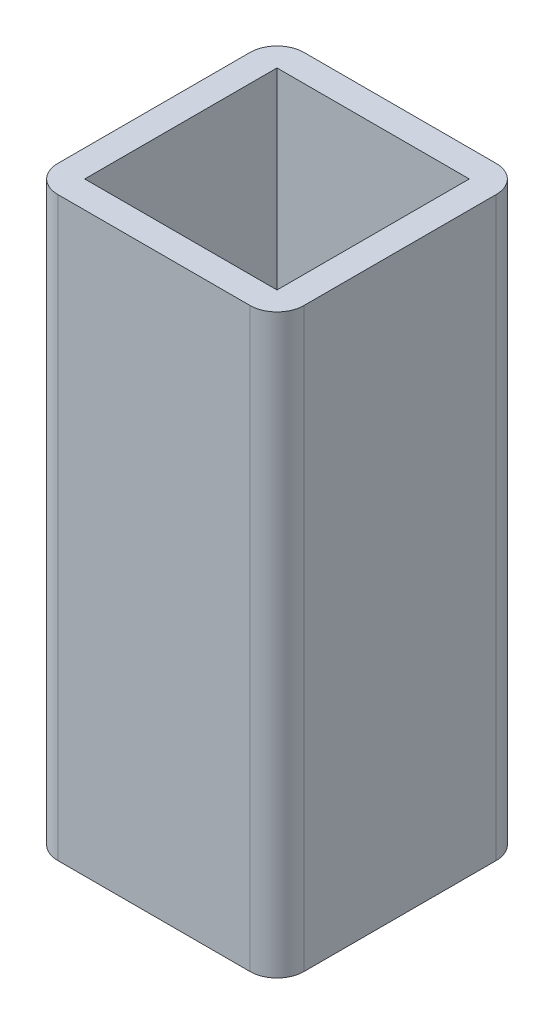
ISO-10303-21;
HEADER;
FILE_DESCRIPTION(('STEP AP214'),'2;1');
FILE_NAME('part.step','',(''),(''),'','','');
FILE_SCHEMA(('AUTOMOTIVE_DESIGN { 1 0 10303 214 1 1 1 1 }'));
ENDSEC;
DATA;
#1=APPLICATION_CONTEXT('core data for automotive mechanical design processes');
#2=APPLICATION_PROTOCOL_DEFINITION('international standard','automotive_design',2000,#1);
#3=PRODUCT_CONTEXT('',#1,'mechanical');
#4=PRODUCT('Part','Part','',(#3));
#5=PRODUCT_RELATED_PRODUCT_CATEGORY('part','',(#4));
#6=PRODUCT_DEFINITION_FORMATION('','',#4);
#7=PRODUCT_DEFINITION_CONTEXT('part definition',#1,'design');
#8=PRODUCT_DEFINITION('design','',#6,#7);
#9=PRODUCT_DEFINITION_SHAPE('','',#8);
#10=(LENGTH_UNIT() NAMED_UNIT(*) SI_UNIT(.MILLI.,.METRE.));
#11=(NAMED_UNIT(*) PLANE_ANGLE_UNIT() SI_UNIT($,.RADIAN.));
#12=(NAMED_UNIT(*) SI_UNIT($,.STERADIAN.) SOLID_ANGLE_UNIT());
#13=UNCERTAINTY_MEASURE_WITH_UNIT(LENGTH_MEASURE(1.E-05),#10,'distance_accuracy_value','');
#14=(GEOMETRIC_REPRESENTATION_CONTEXT(3) GLOBAL_UNCERTAINTY_ASSIGNED_CONTEXT((#13)) GLOBAL_UNIT_ASSIGNED_CONTEXT((#10,
#11,#12)) REPRESENTATION_CONTEXT('',''));
#15=CARTESIAN_POINT('',(0.,0.,0.));
#16=DIRECTION('',(0.,0.,1.));
#17=DIRECTION('',(1.,0.,0.));
#18=AXIS2_PLACEMENT_3D('',#15,#16,#17);
#19=CARTESIAN_POINT('',(22.8,60.,2.8));
#20=DIRECTION('',(0.,-1.,0.));
#21=DIRECTION('',(0.,0.,-1.));
#22=AXIS2_PLACEMENT_3D('',#19,#20,#21);
#23=CYLINDRICAL_SURFACE('',#22,2.8);
#24=CARTESIAN_POINT('',(22.8,0.,2.8));
#25=DIRECTION('',(0.,1.,0.));
#26=DIRECTION('',(0.,0.,-1.));
#27=AXIS2_PLACEMENT_3D('',#24,#25,#26);
#28=CIRCLE('',#27,2.8);
#29=CARTESIAN_POINT('',(25.6,0.,2.80000000000002));
#30=VERTEX_POINT('',#29);
#31=CARTESIAN_POINT('',(22.8,0.,0.));
#32=VERTEX_POINT('',#31);
#33=EDGE_CURVE('E158',#30,#32,#28,.T.);
#34=ORIENTED_EDGE('',*,*,#33,.T.);
#35=DIRECTION('',(0.,-1.,0.));
#36=VECTOR('',#35,1.);
#37=CARTESIAN_POINT('',(22.8,60.,0.));
#38=LINE('',#37,#36);
#39=CARTESIAN_POINT('',(22.8,60.,0.));
#40=VERTEX_POINT('',#39);
#41=EDGE_CURVE('E11',#40,#32,#38,.T.);
#42=ORIENTED_EDGE('',*,*,#41,.F.);
#43=CARTESIAN_POINT('',(22.8,60.,2.8));
#44=DIRECTION('',(0.,1.,0.));
#45=DIRECTION('',(0.,0.,-1.));
#46=AXIS2_PLACEMENT_3D('',#43,#44,#45);
#47=CIRCLE('',#46,2.8);
#48=CARTESIAN_POINT('',(25.6,60.,2.80000000000002));
#49=VERTEX_POINT('',#48);
#50=EDGE_CURVE('E159',#49,#40,#47,.T.);
#51=ORIENTED_EDGE('',*,*,#50,.F.);
#52=DIRECTION('',(0.,-1.,0.));
#53=VECTOR('',#52,1.);
#54=CARTESIAN_POINT('',(25.6,60.,2.80000000000002));
#55=LINE('',#54,#53);
#56=EDGE_CURVE('E177',#49,#30,#55,.T.);
#57=ORIENTED_EDGE('',*,*,#56,.T.);
#58=EDGE_LOOP('',(#34,#42,#51,#57));
#59=FACE_BOUND('',#58,.T.);
#60=ADVANCED_FACE('F33',(#59),#23,.T.);
#61=CARTESIAN_POINT('',(2.80000000000002,60.,0.));
#62=DIRECTION('',(0.,0.,1.));
#63=DIRECTION('',(1.,0.,0.));
#64=AXIS2_PLACEMENT_3D('',#61,#62,#63);
#65=PLANE('',#64);
#66=DIRECTION('',(-1.,0.,0.));
#67=VECTOR('',#66,1.);
#68=CARTESIAN_POINT('',(2.80000000000002,0.,0.));
#69=LINE('',#68,#67);
#70=CARTESIAN_POINT('',(2.80000000000002,0.,0.));
#71=VERTEX_POINT('',#70);
#72=EDGE_CURVE('E180',#32,#71,#69,.T.);
#73=ORIENTED_EDGE('',*,*,#72,.T.);
#74=DIRECTION('',(0.,-1.,0.));
#75=VECTOR('',#74,1.);
#76=CARTESIAN_POINT('',(2.80000000000002,60.,0.));
#77=LINE('',#76,#75);
#78=CARTESIAN_POINT('',(2.80000000000002,60.,0.));
#79=VERTEX_POINT('',#78);
#80=EDGE_CURVE('E40',#79,#71,#77,.T.);
#81=ORIENTED_EDGE('',*,*,#80,.F.);
#82=DIRECTION('',(-1.,0.,0.));
#83=VECTOR('',#82,1.);
#84=CARTESIAN_POINT('',(2.80000000000002,60.,0.));
#85=LINE('',#84,#83);
#86=EDGE_CURVE('E162',#40,#79,#85,.T.);
#87=ORIENTED_EDGE('',*,*,#86,.F.);
#88=ORIENTED_EDGE('',*,*,#41,.T.);
#89=EDGE_LOOP('',(#73,#81,#87,#88));
#90=FACE_BOUND('',#89,.T.);
#91=ADVANCED_FACE('F235',(#90),#65,.F.);
#92=CARTESIAN_POINT('',(2.8,60.,2.8));
#93=DIRECTION('',(0.,-1.,0.));
#94=DIRECTION('',(0.,0.,-1.));
#95=AXIS2_PLACEMENT_3D('',#92,#93,#94);
#96=CYLINDRICAL_SURFACE('',#95,2.8);
#97=CARTESIAN_POINT('',(2.8,0.,2.8));
#98=DIRECTION('',(0.,1.,0.));
#99=DIRECTION('',(0.,0.,1.));
#100=AXIS2_PLACEMENT_3D('',#97,#98,#99);
#101=CIRCLE('',#100,2.8);
#102=CARTESIAN_POINT('',(0.,0.,2.80000000000002));
#103=VERTEX_POINT('',#102);
#104=EDGE_CURVE('E182',#71,#103,#101,.T.);
#105=ORIENTED_EDGE('',*,*,#104,.T.);
#106=DIRECTION('',(0.,-1.,0.));
#107=VECTOR('',#106,1.);
#108=CARTESIAN_POINT('',(0.,60.,2.80000000000002));
#109=LINE('',#108,#107);
#110=CARTESIAN_POINT('',(0.,60.,2.80000000000002));
#111=VERTEX_POINT('',#110);
#112=EDGE_CURVE('E207',#111,#103,#109,.T.);
#113=ORIENTED_EDGE('',*,*,#112,.F.);
#114=CARTESIAN_POINT('',(2.8,60.,2.8));
#115=DIRECTION('',(0.,1.,0.));
#116=DIRECTION('',(0.,0.,1.));
#117=AXIS2_PLACEMENT_3D('',#114,#115,#116);
#118=CIRCLE('',#117,2.8);
#119=EDGE_CURVE('E165',#79,#111,#118,.T.);
#120=ORIENTED_EDGE('',*,*,#119,.F.);
#121=ORIENTED_EDGE('',*,*,#80,.T.);
#122=EDGE_LOOP('',(#105,#113,#120,#121));
#123=FACE_BOUND('',#122,.T.);
#124=ADVANCED_FACE('F214',(#123),#96,.T.);
#125=CARTESIAN_POINT('',(0.,60.,2.80000000000002));
#126=DIRECTION('',(1.,0.,0.));
#127=DIRECTION('',(0.,0.,-1.));
#128=AXIS2_PLACEMENT_3D('',#125,#126,#127);
#129=PLANE('',#128);
#130=DIRECTION('',(0.,0.,1.));
#131=VECTOR('',#130,1.);
#132=CARTESIAN_POINT('',(0.,0.,2.80000000000002));
#133=LINE('',#132,#131);
#134=CARTESIAN_POINT('',(0.,0.,22.8));
#135=VERTEX_POINT('',#134);
#136=EDGE_CURVE('E184',#103,#135,#133,.T.);
#137=ORIENTED_EDGE('',*,*,#136,.T.);
#138=DIRECTION('',(0.,-1.,0.));
#139=VECTOR('',#138,1.);
#140=CARTESIAN_POINT('',(0.,60.,22.8));
#141=LINE('',#140,#139);
#142=CARTESIAN_POINT('',(0.,60.,22.8));
#143=VERTEX_POINT('',#142);
#144=EDGE_CURVE('E204',#143,#135,#141,.T.);
#145=ORIENTED_EDGE('',*,*,#144,.F.);
#146=DIRECTION('',(0.,0.,1.));
#147=VECTOR('',#146,1.);
#148=CARTESIAN_POINT('',(0.,60.,2.80000000000002));
#149=LINE('',#148,#147);
#150=EDGE_CURVE('E167',#111,#143,#149,.T.);
#151=ORIENTED_EDGE('',*,*,#150,.F.);
#152=ORIENTED_EDGE('',*,*,#112,.T.);
#153=EDGE_LOOP('',(#137,#145,#151,#152));
#154=FACE_BOUND('',#153,.T.);
#155=ADVANCED_FACE('F223',(#154),#129,.F.);
#156=CARTESIAN_POINT('',(2.8,60.,22.8));
#157=DIRECTION('',(0.,-1.,0.));
#158=DIRECTION('',(0.,0.,-1.));
#159=AXIS2_PLACEMENT_3D('',#156,#157,#158);
#160=CYLINDRICAL_SURFACE('',#159,2.8);
#161=CARTESIAN_POINT('',(2.8,0.,22.8));
#162=DIRECTION('',(0.,1.,0.));
#163=DIRECTION('',(0.,0.,1.));
#164=AXIS2_PLACEMENT_3D('',#161,#162,#163);
#165=CIRCLE('',#164,2.8);
#166=CARTESIAN_POINT('',(2.80000000000002,0.,25.6));
#167=VERTEX_POINT('',#166);
#168=EDGE_CURVE('E186',#135,#167,#165,.T.);
#169=ORIENTED_EDGE('',*,*,#168,.T.);
#170=DIRECTION('',(0.,-1.,0.));
#171=VECTOR('',#170,1.);
#172=CARTESIAN_POINT('',(2.80000000000002,60.,25.6));
#173=LINE('',#172,#171);
#174=CARTESIAN_POINT('',(2.80000000000002,60.,25.6));
#175=VERTEX_POINT('',#174);
#176=EDGE_CURVE('E201',#175,#167,#173,.T.);
#177=ORIENTED_EDGE('',*,*,#176,.F.);
#178=CARTESIAN_POINT('',(2.8,60.,22.8));
#179=DIRECTION('',(0.,1.,0.));
#180=DIRECTION('',(0.,0.,1.));
#181=AXIS2_PLACEMENT_3D('',#178,#179,#180);
#182=CIRCLE('',#181,2.8);
#183=EDGE_CURVE('E169',#143,#175,#182,.T.);
#184=ORIENTED_EDGE('',*,*,#183,.F.);
#185=ORIENTED_EDGE('',*,*,#144,.T.);
#186=EDGE_LOOP('',(#169,#177,#184,#185));
#187=FACE_BOUND('',#186,.T.);
#188=ADVANCED_FACE('F227',(#187),#160,.T.);
#189=CARTESIAN_POINT('',(2.80000000000002,60.,25.6));
#190=DIRECTION('',(0.,0.,-1.));
#191=DIRECTION('',(-1.,0.,0.));
#192=AXIS2_PLACEMENT_3D('',#189,#190,#191);
#193=PLANE('',#192);
#194=DIRECTION('',(1.,0.,0.));
#195=VECTOR('',#194,1.);
#196=CARTESIAN_POINT('',(2.80000000000002,0.,25.6));
#197=LINE('',#196,#195);
#198=CARTESIAN_POINT('',(22.8,0.,25.6));
#199=VERTEX_POINT('',#198);
#200=EDGE_CURVE('E188',#167,#199,#197,.T.);
#201=ORIENTED_EDGE('',*,*,#200,.T.);
#202=DIRECTION('',(0.,-1.,0.));
#203=VECTOR('',#202,1.);
#204=CARTESIAN_POINT('',(22.8,60.,25.6));
#205=LINE('',#204,#203);
#206=CARTESIAN_POINT('',(22.8,60.,25.6));
#207=VERTEX_POINT('',#206);
#208=EDGE_CURVE('E198',#207,#199,#205,.T.);
#209=ORIENTED_EDGE('',*,*,#208,.F.);
#210=DIRECTION('',(1.,0.,0.));
#211=VECTOR('',#210,1.);
#212=CARTESIAN_POINT('',(2.80000000000002,60.,25.6));
#213=LINE('',#212,#211);
#214=EDGE_CURVE('E171',#175,#207,#213,.T.);
#215=ORIENTED_EDGE('',*,*,#214,.F.);
#216=ORIENTED_EDGE('',*,*,#176,.T.);
#217=EDGE_LOOP('',(#201,#209,#215,#216));
#218=FACE_BOUND('',#217,.T.);
#219=ADVANCED_FACE('F248',(#218),#193,.F.);
#220=CARTESIAN_POINT('',(22.8,60.,22.8));
#221=DIRECTION('',(0.,-1.,0.));
#222=DIRECTION('',(0.,0.,-1.));
#223=AXIS2_PLACEMENT_3D('',#220,#221,#222);
#224=CYLINDRICAL_SURFACE('',#223,2.8);
#225=CARTESIAN_POINT('',(22.8,0.,22.8));
#226=DIRECTION('',(0.,1.,0.));
#227=DIRECTION('',(0.,0.,1.));
#228=AXIS2_PLACEMENT_3D('',#225,#226,#227);
#229=CIRCLE('',#228,2.8);
#230=CARTESIAN_POINT('',(25.6,0.,22.8));
#231=VERTEX_POINT('',#230);
#232=EDGE_CURVE('E190',#199,#231,#229,.T.);
#233=ORIENTED_EDGE('',*,*,#232,.T.);
#234=DIRECTION('',(0.,-1.,0.));
#235=VECTOR('',#234,1.);
#236=CARTESIAN_POINT('',(25.6,60.,22.8));
#237=LINE('',#236,#235);
#238=CARTESIAN_POINT('',(25.6,60.,22.8));
#239=VERTEX_POINT('',#238);
#240=EDGE_CURVE('E195',#239,#231,#237,.T.);
#241=ORIENTED_EDGE('',*,*,#240,.F.);
#242=CARTESIAN_POINT('',(22.8,60.,22.8));
#243=DIRECTION('',(0.,1.,0.));
#244=DIRECTION('',(0.,0.,1.));
#245=AXIS2_PLACEMENT_3D('',#242,#243,#244);
#246=CIRCLE('',#245,2.8);
#247=EDGE_CURVE('E173',#207,#239,#246,.T.);
#248=ORIENTED_EDGE('',*,*,#247,.F.);
#249=ORIENTED_EDGE('',*,*,#208,.T.);
#250=EDGE_LOOP('',(#233,#241,#248,#249));
#251=FACE_BOUND('',#250,.T.);
#252=ADVANCED_FACE('F246',(#251),#224,.T.);
#253=CARTESIAN_POINT('',(25.6,60.,2.80000000000002));
#254=DIRECTION('',(-1.,0.,0.));
#255=DIRECTION('',(0.,0.,1.));
#256=AXIS2_PLACEMENT_3D('',#253,#254,#255);
#257=PLANE('',#256);
#258=DIRECTION('',(0.,0.,-1.));
#259=VECTOR('',#258,1.);
#260=CARTESIAN_POINT('',(25.6,0.,2.80000000000002));
#261=LINE('',#260,#259);
#262=EDGE_CURVE('E163',#231,#30,#261,.T.);
#263=ORIENTED_EDGE('',*,*,#262,.T.);
#264=ORIENTED_EDGE('',*,*,#56,.F.);
#265=DIRECTION('',(0.,0.,-1.));
#266=VECTOR('',#265,1.);
#267=CARTESIAN_POINT('',(25.6,60.,2.80000000000002));
#268=LINE('',#267,#266);
#269=EDGE_CURVE('E175',#239,#49,#268,.T.);
#270=ORIENTED_EDGE('',*,*,#269,.F.);
#271=ORIENTED_EDGE('',*,*,#240,.T.);
#272=EDGE_LOOP('',(#263,#264,#270,#271));
#273=FACE_BOUND('',#272,.T.);
#274=ADVANCED_FACE('F241',(#273),#257,.F.);
#275=CARTESIAN_POINT('',(22.8,60.,2.8));
#276=DIRECTION('',(0.,-1.,0.));
#277=DIRECTION('',(0.,0.,-1.));
#278=AXIS2_PLACEMENT_3D('',#275,#276,#277);
#279=PLANE('',#278);
#280=DIRECTION('',(1.,0.,0.));
#281=VECTOR('',#280,1.);
#282=CARTESIAN_POINT('',(22.8,60.,2.8));
#283=LINE('',#282,#281);
#284=CARTESIAN_POINT('',(2.8,60.0000000000001,2.8));
#285=VERTEX_POINT('',#284);
#286=CARTESIAN_POINT('',(22.8,60.0000000000001,2.8));
#287=VERTEX_POINT('',#286);
#288=EDGE_CURVE('E152',#285,#287,#283,.T.);
#289=ORIENTED_EDGE('',*,*,#288,.T.);
#290=DIRECTION('',(0.,0.,1.));
#291=VECTOR('',#290,1.);
#292=CARTESIAN_POINT('',(22.8,60.,2.8));
#293=LINE('',#292,#291);
#294=CARTESIAN_POINT('',(22.8,60.0000000000001,22.8));
#295=VERTEX_POINT('',#294);
#296=EDGE_CURVE('E155',#287,#295,#293,.T.);
#297=ORIENTED_EDGE('',*,*,#296,.T.);
#298=DIRECTION('',(-1.,0.,0.));
#299=VECTOR('',#298,1.);
#300=CARTESIAN_POINT('',(22.8,60.,22.8));
#301=LINE('',#300,#299);
#302=CARTESIAN_POINT('',(2.8,60.,22.8));
#303=VERTEX_POINT('',#302);
#304=EDGE_CURVE('E147',#295,#303,#301,.T.);
#305=ORIENTED_EDGE('',*,*,#304,.T.);
#306=DIRECTION('',(0.,0.,-1.));
#307=VECTOR('',#306,1.);
#308=CARTESIAN_POINT('',(2.8,60.,2.79999999999999));
#309=LINE('',#308,#307);
#310=EDGE_CURVE('E127',#303,#285,#309,.T.);
#311=ORIENTED_EDGE('',*,*,#310,.T.);
#312=EDGE_LOOP('',(#289,#297,#305,#311));
#313=FACE_BOUND('',#312,.T.);
#314=ORIENTED_EDGE('',*,*,#50,.T.);
#315=ORIENTED_EDGE('',*,*,#86,.T.);
#316=ORIENTED_EDGE('',*,*,#119,.T.);
#317=ORIENTED_EDGE('',*,*,#150,.T.);
#318=ORIENTED_EDGE('',*,*,#183,.T.);
#319=ORIENTED_EDGE('',*,*,#214,.T.);
#320=ORIENTED_EDGE('',*,*,#247,.T.);
#321=ORIENTED_EDGE('',*,*,#269,.T.);
#322=EDGE_LOOP('',(#314,#315,#316,#317,#318,#319,#320,#321));
#323=FACE_BOUND('',#322,.T.);
#324=ADVANCED_FACE('F231',(#313,#323),#279,.F.);
#325=CARTESIAN_POINT('',(22.8,0.,2.8));
#326=DIRECTION('',(0.,-1.,0.));
#327=DIRECTION('',(0.,0.,-1.));
#328=AXIS2_PLACEMENT_3D('',#325,#326,#327);
#329=PLANE('',#328);
#330=DIRECTION('',(0.,0.,1.));
#331=VECTOR('',#330,1.);
#332=CARTESIAN_POINT('',(22.8,0.,2.8));
#333=LINE('',#332,#331);
#334=CARTESIAN_POINT('',(22.8,0.,2.8));
#335=VERTEX_POINT('',#334);
#336=CARTESIAN_POINT('',(22.8,0.,22.8));
#337=VERTEX_POINT('',#336);
#338=EDGE_CURVE('E55',#335,#337,#333,.T.);
#339=ORIENTED_EDGE('',*,*,#338,.F.);
#340=DIRECTION('',(1.,0.,0.));
#341=VECTOR('',#340,1.);
#342=CARTESIAN_POINT('',(2.8,0.,2.8));
#343=LINE('',#342,#341);
#344=CARTESIAN_POINT('',(2.8,0.,2.8));
#345=VERTEX_POINT('',#344);
#346=EDGE_CURVE('E140',#345,#335,#343,.T.);
#347=ORIENTED_EDGE('',*,*,#346,.F.);
#348=DIRECTION('',(0.,0.,-1.));
#349=VECTOR('',#348,1.);
#350=CARTESIAN_POINT('',(2.8,0.,2.8));
#351=LINE('',#350,#349);
#352=CARTESIAN_POINT('',(2.8,0.,22.8));
#353=VERTEX_POINT('',#352);
#354=EDGE_CURVE('E124',#353,#345,#351,.T.);
#355=ORIENTED_EDGE('',*,*,#354,.F.);
#356=DIRECTION('',(-1.,0.,0.));
#357=VECTOR('',#356,1.);
#358=CARTESIAN_POINT('',(2.8,0.,22.8));
#359=LINE('',#358,#357);
#360=EDGE_CURVE('E133',#337,#353,#359,.T.);
#361=ORIENTED_EDGE('',*,*,#360,.F.);
#362=EDGE_LOOP('',(#339,#347,#355,#361));
#363=FACE_BOUND('',#362,.T.);
#364=ORIENTED_EDGE('',*,*,#33,.F.);
#365=ORIENTED_EDGE('',*,*,#262,.F.);
#366=ORIENTED_EDGE('',*,*,#232,.F.);
#367=ORIENTED_EDGE('',*,*,#200,.F.);
#368=ORIENTED_EDGE('',*,*,#168,.F.);
#369=ORIENTED_EDGE('',*,*,#136,.F.);
#370=ORIENTED_EDGE('',*,*,#104,.F.);
#371=ORIENTED_EDGE('',*,*,#72,.F.);
#372=EDGE_LOOP('',(#364,#365,#366,#367,#368,#369,#370,#371));
#373=FACE_BOUND('',#372,.T.);
#374=ADVANCED_FACE('F137',(#363,#373),#329,.T.);
#375=CARTESIAN_POINT('',(22.8,1040.5,2.8));
#376=DIRECTION('',(1.,0.,0.));
#377=DIRECTION('',(0.,0.,-1.));
#378=AXIS2_PLACEMENT_3D('',#375,#376,#377);
#379=PLANE('',#378);
#380=DIRECTION('',(0.,-1.,0.));
#381=VECTOR('',#380,1.);
#382=CARTESIAN_POINT('',(22.8,1040.5,2.8));
#383=LINE('',#382,#381);
#384=EDGE_CURVE('E145',#287,#335,#383,.T.);
#385=ORIENTED_EDGE('',*,*,#384,.T.);
#386=ORIENTED_EDGE('',*,*,#338,.T.);
#387=DIRECTION('',(0.,-1.,0.));
#388=VECTOR('',#387,1.);
#389=CARTESIAN_POINT('',(22.8,1040.5,22.8));
#390=LINE('',#389,#388);
#391=EDGE_CURVE('E130',#295,#337,#390,.T.);
#392=ORIENTED_EDGE('',*,*,#391,.F.);
#393=ORIENTED_EDGE('',*,*,#296,.F.);
#394=EDGE_LOOP('',(#385,#386,#392,#393));
#395=FACE_BOUND('',#394,.T.);
#396=ADVANCED_FACE('F311',(#395),#379,.F.);
#397=CARTESIAN_POINT('',(2.8,1040.5,2.8));
#398=DIRECTION('',(0.,0.,-1.));
#399=DIRECTION('',(-1.,0.,0.));
#400=AXIS2_PLACEMENT_3D('',#397,#398,#399);
#401=PLANE('',#400);
#402=DIRECTION('',(0.,-1.,0.));
#403=VECTOR('',#402,1.);
#404=CARTESIAN_POINT('',(2.8,1040.5,2.8));
#405=LINE('',#404,#403);
#406=EDGE_CURVE('E129',#285,#345,#405,.T.);
#407=ORIENTED_EDGE('',*,*,#406,.T.);
#408=ORIENTED_EDGE('',*,*,#346,.T.);
#409=ORIENTED_EDGE('',*,*,#384,.F.);
#410=ORIENTED_EDGE('',*,*,#288,.F.);
#411=EDGE_LOOP('',(#407,#408,#409,#410));
#412=FACE_BOUND('',#411,.T.);
#413=ADVANCED_FACE('F320',(#412),#401,.F.);
#414=CARTESIAN_POINT('',(2.8,1040.5,2.8));
#415=DIRECTION('',(-1.,0.,0.));
#416=DIRECTION('',(0.,0.,1.));
#417=AXIS2_PLACEMENT_3D('',#414,#415,#416);
#418=PLANE('',#417);
#419=DIRECTION('',(0.,-1.,0.));
#420=VECTOR('',#419,1.);
#421=CARTESIAN_POINT('',(2.8,1040.5,22.8));
#422=LINE('',#421,#420);
#423=EDGE_CURVE('E47',#303,#353,#422,.T.);
#424=ORIENTED_EDGE('',*,*,#423,.T.);
#425=ORIENTED_EDGE('',*,*,#354,.T.);
#426=ORIENTED_EDGE('',*,*,#406,.F.);
#427=ORIENTED_EDGE('',*,*,#310,.F.);
#428=EDGE_LOOP('',(#424,#425,#426,#427));
#429=FACE_BOUND('',#428,.T.);
#430=ADVANCED_FACE('F121',(#429),#418,.F.);
#431=CARTESIAN_POINT('',(2.8,1040.5,22.8));
#432=DIRECTION('',(0.,0.,1.));
#433=DIRECTION('',(1.,0.,0.));
#434=AXIS2_PLACEMENT_3D('',#431,#432,#433);
#435=PLANE('',#434);
#436=ORIENTED_EDGE('',*,*,#391,.T.);
#437=ORIENTED_EDGE('',*,*,#360,.T.);
#438=ORIENTED_EDGE('',*,*,#423,.F.);
#439=ORIENTED_EDGE('',*,*,#304,.F.);
#440=EDGE_LOOP('',(#436,#437,#438,#439));
#441=FACE_BOUND('',#440,.T.);
#442=ADVANCED_FACE('F134',(#441),#435,.F.);
#443=CLOSED_SHELL('',(#60,#91,#124,#155,#188,#219,#252,#274,#324,#374,#396,#413,#430,#442));
#444=MANIFOLD_SOLID_BREP('B2',#443);
#445=ADVANCED_BREP_SHAPE_REPRESENTATION('',(#18,#444),#14);
#446=SHAPE_DEFINITION_REPRESENTATION(#9,#445);
ENDSEC;
END-ISO-10303-21;
